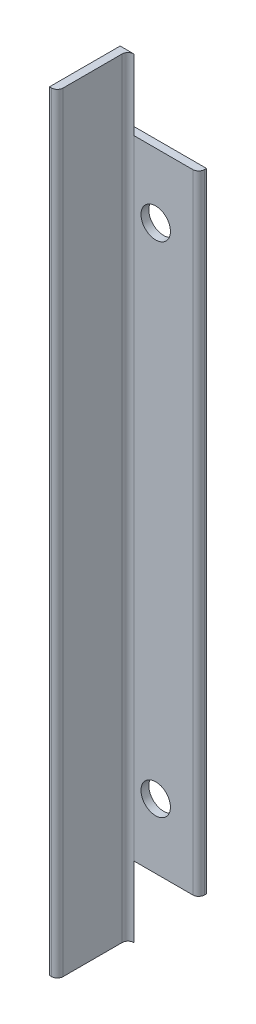
ISO-10303-21;
HEADER;
FILE_DESCRIPTION(('STEP AP214'),'2;1');
FILE_NAME('part.step','',(''),(''),'','','');
FILE_SCHEMA(('AUTOMOTIVE_DESIGN { 1 0 10303 214 1 1 1 1 }'));
ENDSEC;
DATA;
#1=APPLICATION_CONTEXT('core data for automotive mechanical design processes');
#2=APPLICATION_PROTOCOL_DEFINITION('international standard','automotive_design',2000,#1);
#3=PRODUCT_CONTEXT('',#1,'mechanical');
#4=PRODUCT('Part','Part','',(#3));
#5=PRODUCT_RELATED_PRODUCT_CATEGORY('part','',(#4));
#6=PRODUCT_DEFINITION_FORMATION('','',#4);
#7=PRODUCT_DEFINITION_CONTEXT('part definition',#1,'design');
#8=PRODUCT_DEFINITION('design','',#6,#7);
#9=PRODUCT_DEFINITION_SHAPE('','',#8);
#10=(LENGTH_UNIT() NAMED_UNIT(*) SI_UNIT(.MILLI.,.METRE.));
#11=(NAMED_UNIT(*) PLANE_ANGLE_UNIT() SI_UNIT($,.RADIAN.));
#12=(NAMED_UNIT(*) SI_UNIT($,.STERADIAN.) SOLID_ANGLE_UNIT());
#13=UNCERTAINTY_MEASURE_WITH_UNIT(LENGTH_MEASURE(1.E-05),#10,'distance_accuracy_value','');
#14=(GEOMETRIC_REPRESENTATION_CONTEXT(3) GLOBAL_UNCERTAINTY_ASSIGNED_CONTEXT((#13)) GLOBAL_UNIT_ASSIGNED_CONTEXT((#10,
#11,#12)) REPRESENTATION_CONTEXT('',''));
#15=CARTESIAN_POINT('',(0.,0.,0.));
#16=DIRECTION('',(0.,0.,1.));
#17=DIRECTION('',(1.,0.,0.));
#18=AXIS2_PLACEMENT_3D('',#15,#16,#17);
#19=CARTESIAN_POINT('',(-27.4998721449561,392.,-28.2131532770162));
#20=DIRECTION('',(-1.,0.,0.));
#21=DIRECTION('',(0.,0.,1.));
#22=AXIS2_PLACEMENT_3D('',#19,#20,#21);
#23=PLANE('',#22);
#24=DIRECTION('',(0.,-1.,0.));
#25=VECTOR('',#24,1.);
#26=CARTESIAN_POINT('',(-27.4998721449561,392.,-29.2131532770162));
#27=LINE('',#26,#25);
#28=CARTESIAN_POINT('',(-27.4998721449561,356.,-29.2131532770175));
#29=VERTEX_POINT('',#28);
#30=CARTESIAN_POINT('',(-27.4998721449561,36.000000000004,-29.2131532770175));
#31=VERTEX_POINT('',#30);
#32=EDGE_CURVE('E162',#29,#31,#27,.T.);
#33=ORIENTED_EDGE('',*,*,#32,.F.);
#34=DIRECTION('',(0.,0.,1.));
#35=VECTOR('',#34,1.);
#36=CARTESIAN_POINT('',(-27.4998721449561,356.,-29.2131532770175));
#37=LINE('',#36,#35);
#38=CARTESIAN_POINT('',(-27.4998721449561,356.,-28.2131532770175));
#39=VERTEX_POINT('',#38);
#40=EDGE_CURVE('E145',#29,#39,#37,.T.);
#41=ORIENTED_EDGE('',*,*,#40,.T.);
#42=DIRECTION('',(0.,-1.,0.));
#43=VECTOR('',#42,1.);
#44=CARTESIAN_POINT('',(-27.4998721449561,392.,-28.2131532770162));
#45=LINE('',#44,#43);
#46=CARTESIAN_POINT('',(-27.4998721449561,36.000000000004,-28.2131532770175));
#47=VERTEX_POINT('',#46);
#48=EDGE_CURVE('E221',#39,#47,#45,.T.);
#49=ORIENTED_EDGE('',*,*,#48,.T.);
#50=DIRECTION('',(0.,0.,-1.));
#51=VECTOR('',#50,1.);
#52=CARTESIAN_POINT('',(-27.4998721449561,36.000000000004,-29.2131532770175));
#53=LINE('',#52,#51);
#54=EDGE_CURVE('E168',#47,#31,#53,.T.);
#55=ORIENTED_EDGE('',*,*,#54,.T.);
#56=EDGE_LOOP('',(#33,#41,#49,#55));
#57=FACE_BOUND('',#56,.T.);
#58=ADVANCED_FACE('F47',(#57),#23,.F.);
#59=CARTESIAN_POINT('',(-27.4998721449561,392.,-29.2131532770162));
#60=DIRECTION('',(0.,0.,1.));
#61=DIRECTION('',(1.,0.,0.));
#62=AXIS2_PLACEMENT_3D('',#59,#60,#61);
#63=PLANE('',#62);
#64=CARTESIAN_POINT('',(-49.3905702742268,323.,-29.2131532770175));
#65=DIRECTION('',(0.,0.,1.));
#66=DIRECTION('',(1.,0.,0.));
#67=AXIS2_PLACEMENT_3D('',#64,#65,#66);
#68=CIRCLE('',#67,7.5);
#69=CARTESIAN_POINT('',(-41.8905702742268,323.,-29.2131532770175));
#70=VERTEX_POINT('',#69);
#71=EDGE_CURVE('E189',#70,#70,#68,.T.);
#72=ORIENTED_EDGE('',*,*,#71,.T.);
#73=EDGE_LOOP('',(#72));
#74=FACE_BOUND('',#73,.T.);
#75=CARTESIAN_POINT('',(-49.3905702742268,69.0000000000006,-29.2131532770175));
#76=DIRECTION('',(0.,0.,1.));
#77=DIRECTION('',(1.,0.,0.));
#78=AXIS2_PLACEMENT_3D('',#75,#76,#77);
#79=CIRCLE('',#78,7.5);
#80=CARTESIAN_POINT('',(-41.8905702742268,69.0000000000006,-29.2131532770175));
#81=VERTEX_POINT('',#80);
#82=EDGE_CURVE('E181',#81,#81,#79,.T.);
#83=ORIENTED_EDGE('',*,*,#82,.T.);
#84=EDGE_LOOP('',(#83));
#85=FACE_BOUND('',#84,.T.);
#86=DIRECTION('',(0.,-1.,0.));
#87=VECTOR('',#86,1.);
#88=CARTESIAN_POINT('',(-67.4998721449561,392.,-29.2131532770162));
#89=LINE('',#88,#87);
#90=CARTESIAN_POINT('',(-67.4998721449561,356.,-29.2131532770175));
#91=VERTEX_POINT('',#90);
#92=CARTESIAN_POINT('',(-67.4998721449561,36.0000000000009,-29.2131532770175));
#93=VERTEX_POINT('',#92);
#94=EDGE_CURVE('E164',#91,#93,#89,.T.);
#95=ORIENTED_EDGE('',*,*,#94,.F.);
#96=DIRECTION('',(-1.,0.,0.));
#97=VECTOR('',#96,1.);
#98=CARTESIAN_POINT('',(-27.4998721449561,356.,-29.2131532770175));
#99=LINE('',#98,#97);
#100=EDGE_CURVE('E149',#29,#91,#99,.T.);
#101=ORIENTED_EDGE('',*,*,#100,.F.);
#102=ORIENTED_EDGE('',*,*,#32,.T.);
#103=DIRECTION('',(-1.,0.,0.));
#104=VECTOR('',#103,1.);
#105=CARTESIAN_POINT('',(-27.4998721449561,36.000000000004,-29.2131532770175));
#106=LINE('',#105,#104);
#107=EDGE_CURVE('E155',#31,#93,#106,.T.);
#108=ORIENTED_EDGE('',*,*,#107,.T.);
#109=EDGE_LOOP('',(#95,#101,#102,#108));
#110=FACE_BOUND('',#109,.T.);
#111=ADVANCED_FACE('F160',(#74,#85,#110),#63,.F.);
#112=CARTESIAN_POINT('',(-67.4998721449561,392.,-29.2131532770162));
#113=DIRECTION('',(1.,0.,0.));
#114=DIRECTION('',(0.,0.,-1.));
#115=AXIS2_PLACEMENT_3D('',#112,#113,#114);
#116=PLANE('',#115);
#117=DIRECTION('',(0.,0.,1.));
#118=VECTOR('',#117,1.);
#119=CARTESIAN_POINT('',(-67.4998721449561,392.,-29.2131532770162));
#120=LINE('',#119,#118);
#121=CARTESIAN_POINT('',(-67.4998721449561,392.,-25.2131532770162));
#122=VERTEX_POINT('',#121);
#123=CARTESIAN_POINT('',(-67.4998721449561,392.,10.7868467229838));
#124=VERTEX_POINT('',#123);
#125=EDGE_CURVE('E103',#122,#124,#120,.T.);
#126=ORIENTED_EDGE('',*,*,#125,.F.);
#127=DIRECTION('',(0.,-1.,0.));
#128=VECTOR('',#127,1.);
#129=CARTESIAN_POINT('',(-67.4998721449561,392.,-25.2131532770162));
#130=LINE('',#129,#128);
#131=CARTESIAN_POINT('',(-67.4998721449561,356.,-25.2131532770175));
#132=VERTEX_POINT('',#131);
#133=EDGE_CURVE('E63',#122,#132,#130,.T.);
#134=ORIENTED_EDGE('',*,*,#133,.T.);
#135=DIRECTION('',(0.,0.,-1.));
#136=VECTOR('',#135,1.);
#137=CARTESIAN_POINT('',(-67.4998721449561,356.,-29.2131532770175));
#138=LINE('',#137,#136);
#139=EDGE_CURVE('E209',#132,#91,#138,.T.);
#140=ORIENTED_EDGE('',*,*,#139,.T.);
#141=ORIENTED_EDGE('',*,*,#94,.T.);
#142=DIRECTION('',(0.,0.,1.));
#143=VECTOR('',#142,1.);
#144=CARTESIAN_POINT('',(-67.4998721449561,36.0000000000009,-29.2131532770175));
#145=LINE('',#144,#143);
#146=CARTESIAN_POINT('',(-67.4998721449561,36.0000000000009,-25.2131532770175));
#147=VERTEX_POINT('',#146);
#148=EDGE_CURVE('E206',#93,#147,#145,.T.);
#149=ORIENTED_EDGE('',*,*,#148,.T.);
#150=DIRECTION('',(0.,-1.,0.));
#151=VECTOR('',#150,1.);
#152=CARTESIAN_POINT('',(-67.4998721449561,392.,-25.2131532770162));
#153=LINE('',#152,#151);
#154=CARTESIAN_POINT('',(-67.4998721449561,1.11022302462516E-12,-25.2131532770166));
#155=VERTEX_POINT('',#154);
#156=EDGE_CURVE('E202',#147,#155,#153,.T.);
#157=ORIENTED_EDGE('',*,*,#156,.T.);
#158=DIRECTION('',(0.,0.,1.));
#159=VECTOR('',#158,1.);
#160=CARTESIAN_POINT('',(-67.4998721449561,1.11022302462516E-12,-29.2131532770166));
#161=LINE('',#160,#159);
#162=CARTESIAN_POINT('',(-67.4998721449561,2.22044604925031E-13,10.7868467229834));
#163=VERTEX_POINT('',#162);
#164=EDGE_CURVE('E211',#155,#163,#161,.T.);
#165=ORIENTED_EDGE('',*,*,#164,.T.);
#166=DIRECTION('',(0.,-1.,0.));
#167=VECTOR('',#166,1.);
#168=CARTESIAN_POINT('',(-67.4998721449561,392.,10.7868467229838));
#169=LINE('',#168,#167);
#170=EDGE_CURVE('E173',#124,#163,#169,.T.);
#171=ORIENTED_EDGE('',*,*,#170,.F.);
#172=EDGE_LOOP('',(#126,#134,#140,#141,#149,#157,#165,#171));
#173=FACE_BOUND('',#172,.T.);
#174=ADVANCED_FACE('F271',(#173),#116,.F.);
#175=CARTESIAN_POINT('',(-67.4998721449561,392.,10.7868467229838));
#176=DIRECTION('',(0.,0.,-1.));
#177=DIRECTION('',(-1.,0.,0.));
#178=AXIS2_PLACEMENT_3D('',#175,#176,#177);
#179=PLANE('',#178);
#180=DIRECTION('',(1.,0.,0.));
#181=VECTOR('',#180,1.);
#182=CARTESIAN_POINT('',(-67.4998721449561,2.22044604925031E-13,10.7868467229834));
#183=LINE('',#182,#181);
#184=CARTESIAN_POINT('',(-66.4998721449561,2.22044604925031E-13,10.7868467229834));
#185=VERTEX_POINT('',#184);
#186=EDGE_CURVE('E223',#163,#185,#183,.T.);
#187=ORIENTED_EDGE('',*,*,#186,.T.);
#188=DIRECTION('',(0.,-1.,0.));
#189=VECTOR('',#188,1.);
#190=CARTESIAN_POINT('',(-66.4998721449561,392.,10.7868467229838));
#191=LINE('',#190,#189);
#192=CARTESIAN_POINT('',(-66.4998721449561,392.,10.7868467229838));
#193=VERTEX_POINT('',#192);
#194=EDGE_CURVE('E244',#193,#185,#191,.T.);
#195=ORIENTED_EDGE('',*,*,#194,.F.);
#196=DIRECTION('',(1.,0.,0.));
#197=VECTOR('',#196,1.);
#198=CARTESIAN_POINT('',(-67.4998721449561,392.,10.7868467229838));
#199=LINE('',#198,#197);
#200=EDGE_CURVE('E213',#124,#193,#199,.T.);
#201=ORIENTED_EDGE('',*,*,#200,.F.);
#202=ORIENTED_EDGE('',*,*,#170,.T.);
#203=EDGE_LOOP('',(#187,#195,#201,#202));
#204=FACE_BOUND('',#203,.T.);
#205=ADVANCED_FACE('F250',(#204),#179,.F.);
#206=CARTESIAN_POINT('',(-66.4998721449561,392.000000000001,7.7868467229838));
#207=DIRECTION('',(0.,-1.,0.));
#208=DIRECTION('',(0.,0.,-1.));
#209=AXIS2_PLACEMENT_3D('',#206,#207,#208);
#210=CYLINDRICAL_SURFACE('',#209,3.);
#211=CARTESIAN_POINT('',(-66.4998721449561,2.22044604925031E-13,7.78684672298335));
#212=DIRECTION('',(0.,1.,0.));
#213=DIRECTION('',(0.,0.,1.));
#214=AXIS2_PLACEMENT_3D('',#211,#212,#213);
#215=CIRCLE('',#214,3.);
#216=CARTESIAN_POINT('',(-63.4998721449561,1.11022302462516E-12,7.78684672298335));
#217=VERTEX_POINT('',#216);
#218=EDGE_CURVE('E225',#185,#217,#215,.T.);
#219=ORIENTED_EDGE('',*,*,#218,.T.);
#220=DIRECTION('',(0.,-1.,0.));
#221=VECTOR('',#220,1.);
#222=CARTESIAN_POINT('',(-63.4998721449561,392.000000000001,7.78684672298374));
#223=LINE('',#222,#221);
#224=CARTESIAN_POINT('',(-63.4998721449561,392.000000000001,7.78684672298374));
#225=VERTEX_POINT('',#224);
#226=EDGE_CURVE('E241',#225,#217,#223,.T.);
#227=ORIENTED_EDGE('',*,*,#226,.F.);
#228=CARTESIAN_POINT('',(-66.4998721449561,392.000000000001,7.7868467229838));
#229=DIRECTION('',(0.,1.,0.));
#230=DIRECTION('',(0.,0.,1.));
#231=AXIS2_PLACEMENT_3D('',#228,#229,#230);
#232=CIRCLE('',#231,3.);
#233=EDGE_CURVE('E216',#193,#225,#232,.T.);
#234=ORIENTED_EDGE('',*,*,#233,.F.);
#235=ORIENTED_EDGE('',*,*,#194,.T.);
#236=EDGE_LOOP('',(#219,#227,#234,#235));
#237=FACE_BOUND('',#236,.T.);
#238=ADVANCED_FACE('F261',(#237),#210,.T.);
#239=CARTESIAN_POINT('',(-63.4998721449561,392.000000000001,7.78684672298374));
#240=DIRECTION('',(-1.,0.,0.));
#241=DIRECTION('',(0.,0.,1.));
#242=AXIS2_PLACEMENT_3D('',#239,#240,#241);
#243=PLANE('',#242);
#244=DIRECTION('',(0.,0.,-1.));
#245=VECTOR('',#244,1.);
#246=CARTESIAN_POINT('',(-63.4998721449561,1.11022302462516E-12,7.78684672298335));
#247=LINE('',#246,#245);
#248=CARTESIAN_POINT('',(-63.4998721449561,3.99680288865056E-12,-22.2131532770166));
#249=VERTEX_POINT('',#248);
#250=EDGE_CURVE('E227',#217,#249,#247,.T.);
#251=ORIENTED_EDGE('',*,*,#250,.T.);
#252=DIRECTION('',(0.,-1.,0.));
#253=VECTOR('',#252,1.);
#254=CARTESIAN_POINT('',(-63.4998721449561,392.,-22.2131532770162));
#255=LINE('',#254,#253);
#256=CARTESIAN_POINT('',(-63.4998721449561,392.,-22.2131532770162));
#257=VERTEX_POINT('',#256);
#258=EDGE_CURVE('E238',#257,#249,#255,.T.);
#259=ORIENTED_EDGE('',*,*,#258,.F.);
#260=DIRECTION('',(0.,0.,-1.));
#261=VECTOR('',#260,1.);
#262=CARTESIAN_POINT('',(-63.4998721449561,392.000000000001,7.78684672298374));
#263=LINE('',#262,#261);
#264=EDGE_CURVE('E72',#225,#257,#263,.T.);
#265=ORIENTED_EDGE('',*,*,#264,.F.);
#266=ORIENTED_EDGE('',*,*,#226,.T.);
#267=EDGE_LOOP('',(#251,#259,#265,#266));
#268=FACE_BOUND('',#267,.T.);
#269=ADVANCED_FACE('F264',(#268),#243,.F.);
#270=CARTESIAN_POINT('',(-60.4998721449561,392.,-22.2131532770162));
#271=DIRECTION('',(0.,-1.,0.));
#272=DIRECTION('',(0.,0.,-1.));
#273=AXIS2_PLACEMENT_3D('',#270,#271,#272);
#274=CYLINDRICAL_SURFACE('',#273,3.);
#275=CARTESIAN_POINT('',(-60.4998721449561,3.99680288865056E-12,-22.2131532770166));
#276=DIRECTION('',(0.,-1.,0.));
#277=DIRECTION('',(0.,0.,-1.));
#278=AXIS2_PLACEMENT_3D('',#275,#276,#277);
#279=CIRCLE('',#278,3.);
#280=CARTESIAN_POINT('',(-60.4998721449561,3.99680288865056E-12,-25.2131532770166));
#281=VERTEX_POINT('',#280);
#282=EDGE_CURVE('E214',#249,#281,#279,.T.);
#283=ORIENTED_EDGE('',*,*,#282,.T.);
#284=DIRECTION('',(0.,-1.,0.));
#285=VECTOR('',#284,1.);
#286=CARTESIAN_POINT('',(-60.4998721449561,392.,-25.2131532770162));
#287=LINE('',#286,#285);
#288=CARTESIAN_POINT('',(-60.4998721449561,36.000000000004,-25.2131532770175));
#289=VERTEX_POINT('',#288);
#290=EDGE_CURVE('E97',#281,#289,#287,.F.);
#291=ORIENTED_EDGE('',*,*,#290,.T.);
#292=DIRECTION('',(0.,-1.,0.));
#293=VECTOR('',#292,1.);
#294=CARTESIAN_POINT('',(-60.4998721449561,392.,-25.2131532770162));
#295=LINE('',#294,#293);
#296=CARTESIAN_POINT('',(-60.4998721449561,356.,-25.2131532770175));
#297=VERTEX_POINT('',#296);
#298=EDGE_CURVE('E235',#297,#289,#295,.T.);
#299=ORIENTED_EDGE('',*,*,#298,.F.);
#300=CARTESIAN_POINT('',(-60.4998721449561,392.,-25.2131532770162));
#301=VERTEX_POINT('',#300);
#302=EDGE_CURVE('E236',#301,#297,#295,.T.);
#303=ORIENTED_EDGE('',*,*,#302,.F.);
#304=CARTESIAN_POINT('',(-60.4998721449561,392.,-22.2131532770162));
#305=DIRECTION('',(0.,-1.,0.));
#306=DIRECTION('',(0.,0.,-1.));
#307=AXIS2_PLACEMENT_3D('',#304,#305,#306);
#308=CIRCLE('',#307,3.);
#309=EDGE_CURVE('E219',#257,#301,#308,.T.);
#310=ORIENTED_EDGE('',*,*,#309,.F.);
#311=ORIENTED_EDGE('',*,*,#258,.T.);
#312=EDGE_LOOP('',(#283,#291,#299,#303,#310,#311));
#313=FACE_BOUND('',#312,.T.);
#314=ADVANCED_FACE('F268',(#313),#274,.F.);
#315=CARTESIAN_POINT('',(-60.4998721449561,392.,-25.2131532770162));
#316=DIRECTION('',(0.,0.,-1.));
#317=DIRECTION('',(-1.,0.,0.));
#318=AXIS2_PLACEMENT_3D('',#315,#316,#317);
#319=PLANE('',#318);
#320=CARTESIAN_POINT('',(-49.3905702742268,323.,-25.2131532770175));
#321=DIRECTION('',(0.,0.,-1.));
#322=DIRECTION('',(-1.,0.,0.));
#323=AXIS2_PLACEMENT_3D('',#320,#321,#322);
#324=CIRCLE('',#323,7.5);
#325=CARTESIAN_POINT('',(-56.8905702742268,323.,-25.2131532770175));
#326=VERTEX_POINT('',#325);
#327=EDGE_CURVE('E50',#326,#326,#324,.T.);
#328=ORIENTED_EDGE('',*,*,#327,.T.);
#329=EDGE_LOOP('',(#328));
#330=FACE_BOUND('',#329,.T.);
#331=CARTESIAN_POINT('',(-49.3905702742268,69.0000000000002,-25.2131532770175));
#332=DIRECTION('',(0.,0.,-1.));
#333=DIRECTION('',(-1.,0.,0.));
#334=AXIS2_PLACEMENT_3D('',#331,#332,#333);
#335=CIRCLE('',#334,7.5);
#336=CARTESIAN_POINT('',(-56.8905702742268,69.0000000000002,-25.2131532770175));
#337=VERTEX_POINT('',#336);
#338=EDGE_CURVE('E179',#337,#337,#335,.T.);
#339=ORIENTED_EDGE('',*,*,#338,.T.);
#340=EDGE_LOOP('',(#339));
#341=FACE_BOUND('',#340,.T.);
#342=DIRECTION('',(0.,-1.,0.));
#343=VECTOR('',#342,1.);
#344=CARTESIAN_POINT('',(-30.4998721449562,392.,-25.2131532770162));
#345=LINE('',#344,#343);
#346=CARTESIAN_POINT('',(-30.4998721449561,356.,-25.2131532770175));
#347=VERTEX_POINT('',#346);
#348=CARTESIAN_POINT('',(-30.4998721449561,36.000000000004,-25.2131532770175));
#349=VERTEX_POINT('',#348);
#350=EDGE_CURVE('E232',#347,#349,#345,.T.);
#351=ORIENTED_EDGE('',*,*,#350,.F.);
#352=DIRECTION('',(-1.,0.,0.));
#353=VECTOR('',#352,1.);
#354=CARTESIAN_POINT('',(-27.4998721449561,356.,-25.2131532770175));
#355=LINE('',#354,#353);
#356=EDGE_CURVE('E193',#347,#297,#355,.T.);
#357=ORIENTED_EDGE('',*,*,#356,.T.);
#358=ORIENTED_EDGE('',*,*,#298,.T.);
#359=DIRECTION('',(-1.,0.,0.));
#360=VECTOR('',#359,1.);
#361=CARTESIAN_POINT('',(-27.4998721449561,36.000000000004,-25.2131532770175));
#362=LINE('',#361,#360);
#363=EDGE_CURVE('E198',#349,#289,#362,.T.);
#364=ORIENTED_EDGE('',*,*,#363,.F.);
#365=EDGE_LOOP('',(#351,#357,#358,#364));
#366=FACE_BOUND('',#365,.T.);
#367=ADVANCED_FACE('F304',(#330,#341,#366),#319,.F.);
#368=CARTESIAN_POINT('',(-30.4998721449561,392.,-28.2131532770162));
#369=DIRECTION('',(0.,-1.,0.));
#370=DIRECTION('',(0.,0.,-1.));
#371=AXIS2_PLACEMENT_3D('',#368,#369,#370);
#372=CYLINDRICAL_SURFACE('',#371,3.);
#373=ORIENTED_EDGE('',*,*,#48,.F.);
#374=CARTESIAN_POINT('',(-30.4998721449561,356.,-28.2131532770175));
#375=DIRECTION('',(0.,-1.,0.));
#376=DIRECTION('',(0.,0.,-1.));
#377=AXIS2_PLACEMENT_3D('',#374,#375,#376);
#378=CIRCLE('',#377,3.);
#379=EDGE_CURVE('E13',#39,#347,#378,.T.);
#380=ORIENTED_EDGE('',*,*,#379,.T.);
#381=ORIENTED_EDGE('',*,*,#350,.T.);
#382=CARTESIAN_POINT('',(-30.4998721449561,36.000000000004,-28.2131532770175));
#383=DIRECTION('',(0.,1.,0.));
#384=DIRECTION('',(0.,0.,1.));
#385=AXIS2_PLACEMENT_3D('',#382,#383,#384);
#386=CIRCLE('',#385,3.);
#387=EDGE_CURVE('E55',#349,#47,#386,.T.);
#388=ORIENTED_EDGE('',*,*,#387,.T.);
#389=EDGE_LOOP('',(#373,#380,#381,#388));
#390=FACE_BOUND('',#389,.T.);
#391=ADVANCED_FACE('F307',(#390),#372,.T.);
#392=CARTESIAN_POINT('',(-66.4998721449561,392.000000000001,7.7868467229838));
#393=DIRECTION('',(0.,1.,0.));
#394=DIRECTION('',(0.,0.,1.));
#395=AXIS2_PLACEMENT_3D('',#392,#393,#394);
#396=PLANE('',#395);
#397=DIRECTION('',(1.,0.,0.));
#398=VECTOR('',#397,1.);
#399=CARTESIAN_POINT('',(-66.4998721449561,392.,-25.2131532770162));
#400=LINE('',#399,#398);
#401=EDGE_CURVE('E171',#122,#301,#400,.T.);
#402=ORIENTED_EDGE('',*,*,#401,.F.);
#403=ORIENTED_EDGE('',*,*,#125,.T.);
#404=ORIENTED_EDGE('',*,*,#200,.T.);
#405=ORIENTED_EDGE('',*,*,#233,.T.);
#406=ORIENTED_EDGE('',*,*,#264,.T.);
#407=ORIENTED_EDGE('',*,*,#309,.T.);
#408=EDGE_LOOP('',(#402,#403,#404,#405,#406,#407));
#409=FACE_BOUND('',#408,.T.);
#410=ADVANCED_FACE('F270',(#409),#396,.T.);
#411=CARTESIAN_POINT('',(-66.4998721449561,2.22044604925031E-13,7.78684672298335));
#412=DIRECTION('',(0.,1.,0.));
#413=DIRECTION('',(0.,0.,1.));
#414=AXIS2_PLACEMENT_3D('',#411,#412,#413);
#415=PLANE('',#414);
#416=ORIENTED_EDGE('',*,*,#164,.F.);
#417=DIRECTION('',(1.,0.,0.));
#418=VECTOR('',#417,1.);
#419=CARTESIAN_POINT('',(-66.4998721449561,6.66133814775094E-13,-25.2131532770166));
#420=LINE('',#419,#418);
#421=EDGE_CURVE('E169',#155,#281,#420,.T.);
#422=ORIENTED_EDGE('',*,*,#421,.T.);
#423=ORIENTED_EDGE('',*,*,#282,.F.);
#424=ORIENTED_EDGE('',*,*,#250,.F.);
#425=ORIENTED_EDGE('',*,*,#218,.F.);
#426=ORIENTED_EDGE('',*,*,#186,.F.);
#427=EDGE_LOOP('',(#416,#422,#423,#424,#425,#426));
#428=FACE_BOUND('',#427,.T.);
#429=ADVANCED_FACE('F256',(#428),#415,.F.);
#430=CARTESIAN_POINT('',(-27.4998721449561,36.000000000004,-29.2131532770175));
#431=DIRECTION('',(0.,1.,0.));
#432=DIRECTION('',(0.,0.,1.));
#433=AXIS2_PLACEMENT_3D('',#430,#431,#432);
#434=PLANE('',#433);
#435=ORIENTED_EDGE('',*,*,#107,.F.);
#436=ORIENTED_EDGE('',*,*,#54,.F.);
#437=ORIENTED_EDGE('',*,*,#387,.F.);
#438=ORIENTED_EDGE('',*,*,#363,.T.);
#439=EDGE_CURVE('E196',#289,#147,#362,.T.);
#440=ORIENTED_EDGE('',*,*,#439,.T.);
#441=ORIENTED_EDGE('',*,*,#148,.F.);
#442=EDGE_LOOP('',(#435,#436,#437,#438,#440,#441));
#443=FACE_BOUND('',#442,.T.);
#444=ADVANCED_FACE('F314',(#443),#434,.F.);
#445=CARTESIAN_POINT('',(-27.4998721449561,3.99680288865056E-12,-25.2131532770166));
#446=DIRECTION('',(0.,0.,1.));
#447=DIRECTION('',(0.,-1.,0.));
#448=AXIS2_PLACEMENT_3D('',#445,#446,#447);
#449=PLANE('',#448);
#450=ORIENTED_EDGE('',*,*,#439,.F.);
#451=ORIENTED_EDGE('',*,*,#290,.F.);
#452=ORIENTED_EDGE('',*,*,#421,.F.);
#453=ORIENTED_EDGE('',*,*,#156,.F.);
#454=EDGE_LOOP('',(#450,#451,#452,#453));
#455=FACE_BOUND('',#454,.T.);
#456=ADVANCED_FACE('F284',(#455),#449,.F.);
#457=CARTESIAN_POINT('',(-27.4998721449561,356.,-29.2131532770175));
#458=DIRECTION('',(0.,-1.,0.));
#459=DIRECTION('',(0.,0.,-1.));
#460=AXIS2_PLACEMENT_3D('',#457,#458,#459);
#461=PLANE('',#460);
#462=EDGE_CURVE('E165',#297,#132,#355,.T.);
#463=ORIENTED_EDGE('',*,*,#462,.F.);
#464=ORIENTED_EDGE('',*,*,#356,.F.);
#465=ORIENTED_EDGE('',*,*,#379,.F.);
#466=ORIENTED_EDGE('',*,*,#40,.F.);
#467=ORIENTED_EDGE('',*,*,#100,.T.);
#468=ORIENTED_EDGE('',*,*,#139,.F.);
#469=EDGE_LOOP('',(#463,#464,#465,#466,#467,#468));
#470=FACE_BOUND('',#469,.T.);
#471=ADVANCED_FACE('F148',(#470),#461,.F.);
#472=CARTESIAN_POINT('',(-27.4998721449561,392.,-25.2131532770162));
#473=DIRECTION('',(0.,0.,1.));
#474=DIRECTION('',(0.,-1.,0.));
#475=AXIS2_PLACEMENT_3D('',#472,#473,#474);
#476=PLANE('',#475);
#477=ORIENTED_EDGE('',*,*,#401,.T.);
#478=ORIENTED_EDGE('',*,*,#302,.T.);
#479=ORIENTED_EDGE('',*,*,#462,.T.);
#480=ORIENTED_EDGE('',*,*,#133,.F.);
#481=EDGE_LOOP('',(#477,#478,#479,#480));
#482=FACE_BOUND('',#481,.T.);
#483=ADVANCED_FACE('F273',(#482),#476,.F.);
#484=CARTESIAN_POINT('',(-49.3905702742268,69.0000000000042,10.7868467229825));
#485=DIRECTION('',(0.,0.,-1.));
#486=DIRECTION('',(-1.,0.,0.));
#487=AXIS2_PLACEMENT_3D('',#484,#485,#486);
#488=CYLINDRICAL_SURFACE('',#487,7.5);
#489=ORIENTED_EDGE('',*,*,#338,.F.);
#490=EDGE_LOOP('',(#489));
#491=FACE_BOUND('',#490,.T.);
#492=ORIENTED_EDGE('',*,*,#82,.F.);
#493=EDGE_LOOP('',(#492));
#494=FACE_BOUND('',#493,.T.);
#495=ADVANCED_FACE('F275',(#491,#494),#488,.F.);
#496=CARTESIAN_POINT('',(-49.3905702742268,322.999999999997,10.7868467229825));
#497=DIRECTION('',(0.,0.,-1.));
#498=DIRECTION('',(-1.,0.,0.));
#499=AXIS2_PLACEMENT_3D('',#496,#497,#498);
#500=CYLINDRICAL_SURFACE('',#499,7.5);
#501=ORIENTED_EDGE('',*,*,#327,.F.);
#502=EDGE_LOOP('',(#501));
#503=FACE_BOUND('',#502,.T.);
#504=ORIENTED_EDGE('',*,*,#71,.F.);
#505=EDGE_LOOP('',(#504));
#506=FACE_BOUND('',#505,.T.);
#507=ADVANCED_FACE('F281',(#503,#506),#500,.F.);
#508=CLOSED_SHELL('',(#58,#111,#174,#205,#238,#269,#314,#367,#391,#410,#429,#444,#456,#471,#483,
#495,#507));
#509=MANIFOLD_SOLID_BREP('B2',#508);
#510=ADVANCED_BREP_SHAPE_REPRESENTATION('',(#18,#509),#14);
#511=SHAPE_DEFINITION_REPRESENTATION(#9,#510);
ENDSEC;
END-ISO-10303-21;
